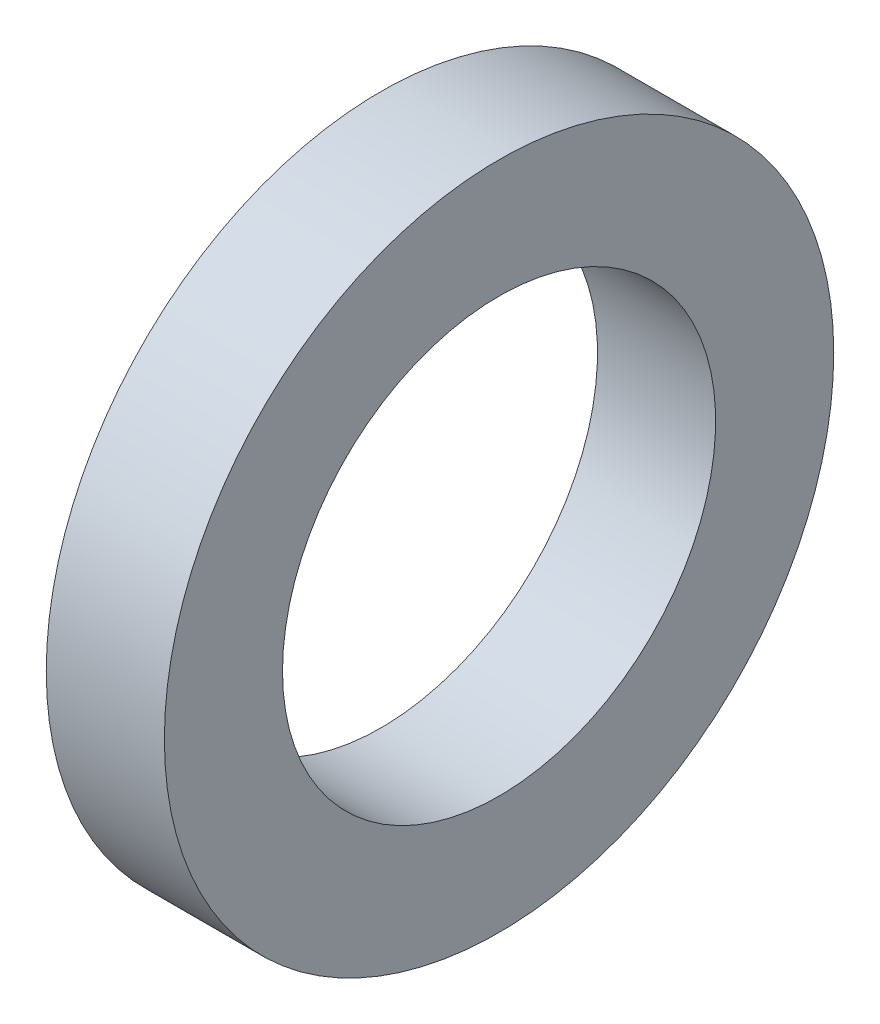
ISO-10303-21;
HEADER;
FILE_DESCRIPTION(('STEP AP214'),'2;1');
FILE_NAME('part.step','',(''),(''),'','','');
FILE_SCHEMA(('AUTOMOTIVE_DESIGN { 1 0 10303 214 1 1 1 1 }'));
ENDSEC;
DATA;
#1=APPLICATION_CONTEXT('core data for automotive mechanical design processes');
#2=APPLICATION_PROTOCOL_DEFINITION('international standard','automotive_design',2000,#1);
#3=PRODUCT_CONTEXT('',#1,'mechanical');
#4=PRODUCT('Part','Part','',(#3));
#5=PRODUCT_RELATED_PRODUCT_CATEGORY('part','',(#4));
#6=PRODUCT_DEFINITION_FORMATION('','',#4);
#7=PRODUCT_DEFINITION_CONTEXT('part definition',#1,'design');
#8=PRODUCT_DEFINITION('design','',#6,#7);
#9=PRODUCT_DEFINITION_SHAPE('','',#8);
#10=(LENGTH_UNIT() NAMED_UNIT(*) SI_UNIT(.MILLI.,.METRE.));
#11=(NAMED_UNIT(*) PLANE_ANGLE_UNIT() SI_UNIT($,.RADIAN.));
#12=(NAMED_UNIT(*) SI_UNIT($,.STERADIAN.) SOLID_ANGLE_UNIT());
#13=UNCERTAINTY_MEASURE_WITH_UNIT(LENGTH_MEASURE(1.E-05),#10,'distance_accuracy_value','');
#14=(GEOMETRIC_REPRESENTATION_CONTEXT(3) GLOBAL_UNCERTAINTY_ASSIGNED_CONTEXT((#13)) GLOBAL_UNIT_ASSIGNED_CONTEXT((#10,
#11,#12)) REPRESENTATION_CONTEXT('',''));
#15=CARTESIAN_POINT('',(0.,0.,0.));
#16=DIRECTION('',(0.,0.,1.));
#17=DIRECTION('',(1.,0.,0.));
#18=AXIS2_PLACEMENT_3D('',#15,#16,#17);
#19=CARTESIAN_POINT('',(0.,2.75,0.));
#20=DIRECTION('',(1.,0.,0.));
#21=DIRECTION('',(0.,0.,-1.));
#22=AXIS2_PLACEMENT_3D('',#19,#20,#21);
#23=PLANE('',#22);
#24=CARTESIAN_POINT('',(0.,0.,0.));
#25=DIRECTION('',(-1.,0.,0.));
#26=DIRECTION('',(0.,0.,1.));
#27=AXIS2_PLACEMENT_3D('',#24,#25,#26);
#28=CIRCLE('',#27,2.75);
#29=CARTESIAN_POINT('',(0.,0.,2.75));
#30=VERTEX_POINT('',#29);
#31=EDGE_CURVE('E46',#30,#30,#28,.T.);
#32=ORIENTED_EDGE('',*,*,#31,.F.);
#33=EDGE_LOOP('',(#32));
#34=FACE_BOUND('',#33,.T.);
#35=CARTESIAN_POINT('',(0.,0.,0.));
#36=DIRECTION('',(-1.,0.,0.));
#37=DIRECTION('',(0.,0.,1.));
#38=AXIS2_PLACEMENT_3D('',#35,#36,#37);
#39=CIRCLE('',#38,4.25);
#40=CARTESIAN_POINT('',(0.,0.,4.25));
#41=VERTEX_POINT('',#40);
#42=EDGE_CURVE('E10',#41,#41,#39,.T.);
#43=ORIENTED_EDGE('',*,*,#42,.T.);
#44=EDGE_LOOP('',(#43));
#45=FACE_BOUND('',#44,.T.);
#46=ADVANCED_FACE('F32',(#34,#45),#23,.F.);
#47=CARTESIAN_POINT('',(0.,0.,0.));
#48=DIRECTION('',(-1.,0.,0.));
#49=DIRECTION('',(0.,0.,1.));
#50=AXIS2_PLACEMENT_3D('',#47,#48,#49);
#51=CYLINDRICAL_SURFACE('',#50,4.25);
#52=ORIENTED_EDGE('',*,*,#42,.F.);
#53=EDGE_LOOP('',(#52));
#54=FACE_BOUND('',#53,.T.);
#55=CARTESIAN_POINT('',(1.5,0.,0.));
#56=DIRECTION('',(-1.,0.,0.));
#57=DIRECTION('',(0.,0.,1.));
#58=AXIS2_PLACEMENT_3D('',#55,#56,#57);
#59=CIRCLE('',#58,4.25);
#60=CARTESIAN_POINT('',(1.5,0.,4.25));
#61=VERTEX_POINT('',#60);
#62=EDGE_CURVE('E38',#61,#61,#59,.T.);
#63=ORIENTED_EDGE('',*,*,#62,.T.);
#64=EDGE_LOOP('',(#63));
#65=FACE_BOUND('',#64,.T.);
#66=ADVANCED_FACE('F55',(#54,#65),#51,.T.);
#67=CARTESIAN_POINT('',(1.5,2.75,0.));
#68=DIRECTION('',(-1.,0.,0.));
#69=DIRECTION('',(0.,0.,1.));
#70=AXIS2_PLACEMENT_3D('',#67,#68,#69);
#71=PLANE('',#70);
#72=ORIENTED_EDGE('',*,*,#62,.F.);
#73=EDGE_LOOP('',(#72));
#74=FACE_BOUND('',#73,.T.);
#75=CARTESIAN_POINT('',(1.5,0.,0.));
#76=DIRECTION('',(-1.,0.,0.));
#77=DIRECTION('',(0.,0.,1.));
#78=AXIS2_PLACEMENT_3D('',#75,#76,#77);
#79=CIRCLE('',#78,2.75);
#80=CARTESIAN_POINT('',(1.5,0.,2.75));
#81=VERTEX_POINT('',#80);
#82=EDGE_CURVE('E42',#81,#81,#79,.T.);
#83=ORIENTED_EDGE('',*,*,#82,.T.);
#84=EDGE_LOOP('',(#83));
#85=FACE_BOUND('',#84,.T.);
#86=ADVANCED_FACE('F59',(#74,#85),#71,.F.);
#87=CARTESIAN_POINT('',(0.,0.,0.));
#88=DIRECTION('',(-1.,0.,0.));
#89=DIRECTION('',(0.,0.,1.));
#90=AXIS2_PLACEMENT_3D('',#87,#88,#89);
#91=CYLINDRICAL_SURFACE('',#90,2.75);
#92=ORIENTED_EDGE('',*,*,#82,.F.);
#93=EDGE_LOOP('',(#92));
#94=FACE_BOUND('',#93,.T.);
#95=ORIENTED_EDGE('',*,*,#31,.T.);
#96=EDGE_LOOP('',(#95));
#97=FACE_BOUND('',#96,.T.);
#98=ADVANCED_FACE('F52',(#94,#97),#91,.F.);
#99=CLOSED_SHELL('',(#46,#66,#86,#98));
#100=MANIFOLD_SOLID_BREP('B2',#99);
#101=ADVANCED_BREP_SHAPE_REPRESENTATION('',(#18,#100),#14);
#102=SHAPE_DEFINITION_REPRESENTATION(#9,#101);
ENDSEC;
END-ISO-10303-21;
